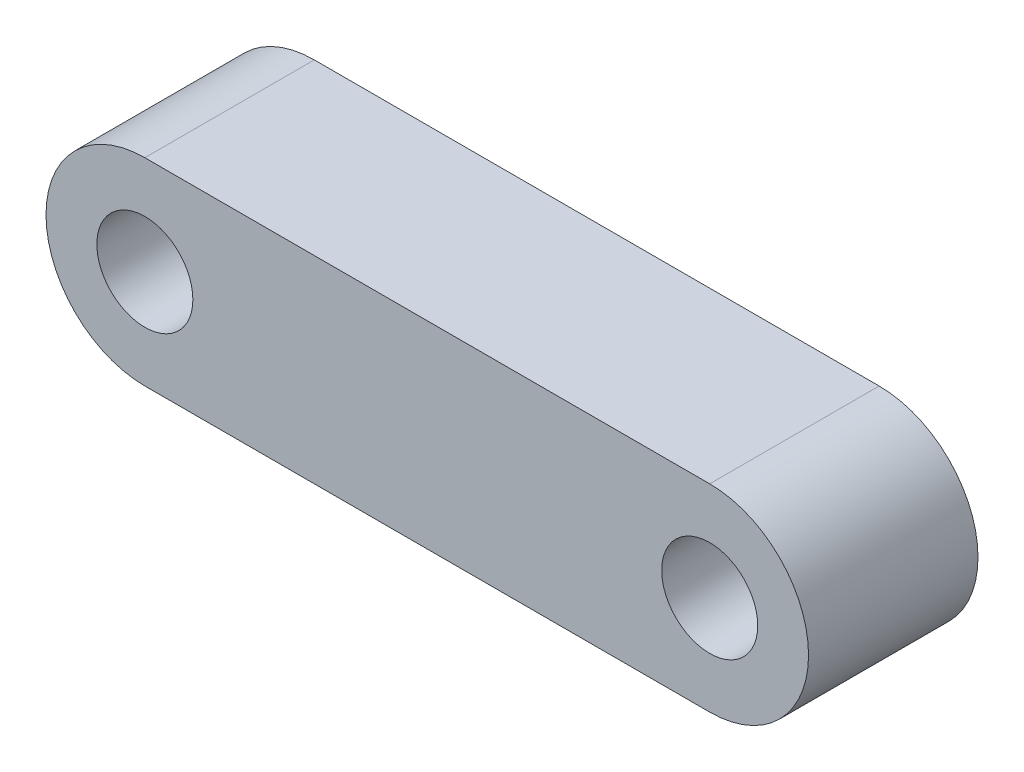
ISO-10303-21;
HEADER;
FILE_DESCRIPTION(('STEP AP214'),'2;1');
FILE_NAME('part.step','',(''),(''),'','','');
FILE_SCHEMA(('AUTOMOTIVE_DESIGN { 1 0 10303 214 1 1 1 1 }'));
ENDSEC;
DATA;
#1=APPLICATION_CONTEXT('core data for automotive mechanical design processes');
#2=APPLICATION_PROTOCOL_DEFINITION('international standard','automotive_design',2000,#1);
#3=PRODUCT_CONTEXT('',#1,'mechanical');
#4=PRODUCT('Part','Part','',(#3));
#5=PRODUCT_RELATED_PRODUCT_CATEGORY('part','',(#4));
#6=PRODUCT_DEFINITION_FORMATION('','',#4);
#7=PRODUCT_DEFINITION_CONTEXT('part definition',#1,'design');
#8=PRODUCT_DEFINITION('design','',#6,#7);
#9=PRODUCT_DEFINITION_SHAPE('','',#8);
#10=(LENGTH_UNIT() NAMED_UNIT(*) SI_UNIT(.MILLI.,.METRE.));
#11=(NAMED_UNIT(*) PLANE_ANGLE_UNIT() SI_UNIT($,.RADIAN.));
#12=(NAMED_UNIT(*) SI_UNIT($,.STERADIAN.) SOLID_ANGLE_UNIT());
#13=UNCERTAINTY_MEASURE_WITH_UNIT(LENGTH_MEASURE(1.E-05),#10,'distance_accuracy_value','');
#14=(GEOMETRIC_REPRESENTATION_CONTEXT(3) GLOBAL_UNCERTAINTY_ASSIGNED_CONTEXT((#13)) GLOBAL_UNIT_ASSIGNED_CONTEXT((#10,
#11,#12)) REPRESENTATION_CONTEXT('',''));
#15=CARTESIAN_POINT('',(0.,0.,0.));
#16=DIRECTION('',(0.,0.,1.));
#17=DIRECTION('',(1.,0.,0.));
#18=AXIS2_PLACEMENT_3D('',#15,#16,#17);
#19=CARTESIAN_POINT('',(0.,0.,0.));
#20=DIRECTION('',(0.,0.,1.));
#21=DIRECTION('',(1.,0.,0.));
#22=AXIS2_PLACEMENT_3D('',#19,#20,#21);
#23=PLANE('',#22);
#24=DIRECTION('',(0.,1.,0.));
#25=VECTOR('',#24,1.);
#26=CARTESIAN_POINT('',(-7.5,-0.5,0.));
#27=LINE('',#26,#25);
#28=CARTESIAN_POINT('',(-7.5,-1.5,0.));
#29=VERTEX_POINT('',#28);
#30=CARTESIAN_POINT('',(-7.5,-0.5,0.));
#31=VERTEX_POINT('',#30);
#32=EDGE_CURVE('E202',#29,#31,#27,.T.);
#33=ORIENTED_EDGE('',*,*,#32,.F.);
#34=DIRECTION('',(1.,0.,0.));
#35=VECTOR('',#34,1.);
#36=CARTESIAN_POINT('',(-7.5,-1.5,0.));
#37=LINE('',#36,#35);
#38=CARTESIAN_POINT('',(7.5,-1.5,0.));
#39=VERTEX_POINT('',#38);
#40=EDGE_CURVE('E226',#29,#39,#37,.T.);
#41=ORIENTED_EDGE('',*,*,#40,.T.);
#42=DIRECTION('',(0.,1.,0.));
#43=VECTOR('',#42,1.);
#44=CARTESIAN_POINT('',(7.5,-0.5,0.));
#45=LINE('',#44,#43);
#46=CARTESIAN_POINT('',(7.5,-0.5,0.));
#47=VERTEX_POINT('',#46);
#48=EDGE_CURVE('E216',#39,#47,#45,.T.);
#49=ORIENTED_EDGE('',*,*,#48,.T.);
#50=DIRECTION('',(1.,0.,0.));
#51=VECTOR('',#50,1.);
#52=CARTESIAN_POINT('',(-7.5,-0.5,0.));
#53=LINE('',#52,#51);
#54=EDGE_CURVE('E215',#31,#47,#53,.T.);
#55=ORIENTED_EDGE('',*,*,#54,.F.);
#56=EDGE_LOOP('',(#33,#41,#49,#55));
#57=FACE_BOUND('',#56,.T.);
#58=CARTESIAN_POINT('',(10.,0.,0.));
#59=DIRECTION('',(0.,0.,1.));
#60=DIRECTION('',(1.,0.,0.));
#61=AXIS2_PLACEMENT_3D('',#58,#59,#60);
#62=CIRCLE('',#61,1.7);
#63=CARTESIAN_POINT('',(11.7,0.,0.));
#64=VERTEX_POINT('',#63);
#65=EDGE_CURVE('E294',#64,#64,#62,.T.);
#66=ORIENTED_EDGE('',*,*,#65,.T.);
#67=EDGE_LOOP('',(#66));
#68=FACE_BOUND('',#67,.T.);
#69=CARTESIAN_POINT('',(-10.,0.,0.));
#70=DIRECTION('',(0.,0.,1.));
#71=DIRECTION('',(1.,0.,0.));
#72=AXIS2_PLACEMENT_3D('',#69,#70,#71);
#73=CIRCLE('',#72,1.7);
#74=CARTESIAN_POINT('',(-8.3,0.,0.));
#75=VERTEX_POINT('',#74);
#76=EDGE_CURVE('E320',#75,#75,#73,.T.);
#77=ORIENTED_EDGE('',*,*,#76,.T.);
#78=EDGE_LOOP('',(#77));
#79=FACE_BOUND('',#78,.T.);
#80=DIRECTION('',(0.,1.,0.));
#81=VECTOR('',#80,1.);
#82=CARTESIAN_POINT('',(-7.5,-2.5,0.));
#83=LINE('',#82,#81);
#84=CARTESIAN_POINT('',(-7.5,-3.5,0.));
#85=VERTEX_POINT('',#84);
#86=CARTESIAN_POINT('',(-7.5,-2.5,0.));
#87=VERTEX_POINT('',#86);
#88=EDGE_CURVE('E234',#85,#87,#83,.T.);
#89=ORIENTED_EDGE('',*,*,#88,.F.);
#90=DIRECTION('',(1.,0.,0.));
#91=VECTOR('',#90,1.);
#92=CARTESIAN_POINT('',(0.,-3.5,0.));
#93=LINE('',#92,#91);
#94=CARTESIAN_POINT('',(-10.,-3.5,0.));
#95=VERTEX_POINT('',#94);
#96=EDGE_CURVE('E324',#95,#85,#93,.T.);
#97=ORIENTED_EDGE('',*,*,#96,.F.);
#98=CARTESIAN_POINT('',(-10.,0.,0.));
#99=DIRECTION('',(0.,0.,1.));
#100=DIRECTION('',(1.,0.,0.));
#101=AXIS2_PLACEMENT_3D('',#98,#99,#100);
#102=CIRCLE('',#101,3.5);
#103=CARTESIAN_POINT('',(-10.,3.5,0.));
#104=VERTEX_POINT('',#103);
#105=EDGE_CURVE('E305',#104,#95,#102,.T.);
#106=ORIENTED_EDGE('',*,*,#105,.F.);
#107=DIRECTION('',(-1.,0.,0.));
#108=VECTOR('',#107,1.);
#109=CARTESIAN_POINT('',(0.,3.5,0.));
#110=LINE('',#109,#108);
#111=CARTESIAN_POINT('',(-7.5,3.5,0.));
#112=VERTEX_POINT('',#111);
#113=EDGE_CURVE('E329',#112,#104,#110,.T.);
#114=ORIENTED_EDGE('',*,*,#113,.F.);
#115=DIRECTION('',(0.,1.,0.));
#116=VECTOR('',#115,1.);
#117=CARTESIAN_POINT('',(-7.5,3.5,0.));
#118=LINE('',#117,#116);
#119=CARTESIAN_POINT('',(-7.5,2.5,0.));
#120=VERTEX_POINT('',#119);
#121=EDGE_CURVE('E265',#120,#112,#118,.T.);
#122=ORIENTED_EDGE('',*,*,#121,.F.);
#123=DIRECTION('',(1.,0.,0.));
#124=VECTOR('',#123,1.);
#125=CARTESIAN_POINT('',(-7.5,2.5,0.));
#126=LINE('',#125,#124);
#127=CARTESIAN_POINT('',(7.5,2.5,0.));
#128=VERTEX_POINT('',#127);
#129=EDGE_CURVE('E291',#120,#128,#126,.T.);
#130=ORIENTED_EDGE('',*,*,#129,.T.);
#131=DIRECTION('',(0.,1.,0.));
#132=VECTOR('',#131,1.);
#133=CARTESIAN_POINT('',(7.5,3.5,0.));
#134=LINE('',#133,#132);
#135=CARTESIAN_POINT('',(7.5,3.5,0.));
#136=VERTEX_POINT('',#135);
#137=EDGE_CURVE('E279',#128,#136,#134,.T.);
#138=ORIENTED_EDGE('',*,*,#137,.T.);
#139=CARTESIAN_POINT('',(10.,3.5,0.));
#140=VERTEX_POINT('',#139);
#141=EDGE_CURVE('E330',#140,#136,#110,.T.);
#142=ORIENTED_EDGE('',*,*,#141,.F.);
#143=CARTESIAN_POINT('',(10.,0.,0.));
#144=DIRECTION('',(0.,0.,1.));
#145=DIRECTION('',(1.,0.,0.));
#146=AXIS2_PLACEMENT_3D('',#143,#144,#145);
#147=CIRCLE('',#146,3.5);
#148=CARTESIAN_POINT('',(10.,-3.5,0.));
#149=VERTEX_POINT('',#148);
#150=EDGE_CURVE('E327',#149,#140,#147,.T.);
#151=ORIENTED_EDGE('',*,*,#150,.F.);
#152=CARTESIAN_POINT('',(7.5,-3.5,0.));
#153=VERTEX_POINT('',#152);
#154=EDGE_CURVE('E323',#153,#149,#93,.T.);
#155=ORIENTED_EDGE('',*,*,#154,.F.);
#156=DIRECTION('',(0.,1.,0.));
#157=VECTOR('',#156,1.);
#158=CARTESIAN_POINT('',(7.5,-2.5,0.));
#159=LINE('',#158,#157);
#160=CARTESIAN_POINT('',(7.5,-2.5,0.));
#161=VERTEX_POINT('',#160);
#162=EDGE_CURVE('E248',#153,#161,#159,.T.);
#163=ORIENTED_EDGE('',*,*,#162,.T.);
#164=DIRECTION('',(1.,0.,0.));
#165=VECTOR('',#164,1.);
#166=CARTESIAN_POINT('',(-7.5,-2.5,0.));
#167=LINE('',#166,#165);
#168=EDGE_CURVE('E247',#87,#161,#167,.T.);
#169=ORIENTED_EDGE('',*,*,#168,.F.);
#170=EDGE_LOOP('',(#89,#97,#106,#114,#122,#130,#138,#142,#151,#155,#163,#169));
#171=FACE_BOUND('',#170,.T.);
#172=DIRECTION('',(0.,1.,0.));
#173=VECTOR('',#172,1.);
#174=CARTESIAN_POINT('',(-7.5,1.5,0.));
#175=LINE('',#174,#173);
#176=CARTESIAN_POINT('',(-7.5,0.5,0.));
#177=VERTEX_POINT('',#176);
#178=CARTESIAN_POINT('',(-7.5,1.5,0.));
#179=VERTEX_POINT('',#178);
#180=EDGE_CURVE('E184',#177,#179,#175,.T.);
#181=ORIENTED_EDGE('',*,*,#180,.F.);
#182=DIRECTION('',(1.,0.,0.));
#183=VECTOR('',#182,1.);
#184=CARTESIAN_POINT('',(-7.5,0.5,0.));
#185=LINE('',#184,#183);
#186=CARTESIAN_POINT('',(7.5,0.5,0.));
#187=VERTEX_POINT('',#186);
#188=EDGE_CURVE('E283',#177,#187,#185,.T.);
#189=ORIENTED_EDGE('',*,*,#188,.T.);
#190=DIRECTION('',(0.,1.,0.));
#191=VECTOR('',#190,1.);
#192=CARTESIAN_POINT('',(7.5,1.5,0.));
#193=LINE('',#192,#191);
#194=CARTESIAN_POINT('',(7.5,1.5,0.));
#195=VERTEX_POINT('',#194);
#196=EDGE_CURVE('E195',#187,#195,#193,.T.);
#197=ORIENTED_EDGE('',*,*,#196,.T.);
#198=DIRECTION('',(1.,0.,0.));
#199=VECTOR('',#198,1.);
#200=CARTESIAN_POINT('',(-7.5,1.5,0.));
#201=LINE('',#200,#199);
#202=EDGE_CURVE('E177',#179,#195,#201,.T.);
#203=ORIENTED_EDGE('',*,*,#202,.F.);
#204=EDGE_LOOP('',(#181,#189,#197,#203));
#205=FACE_BOUND('',#204,.T.);
#206=ADVANCED_FACE('F35',(#57,#68,#79,#171,#205),#23,.F.);
#207=CARTESIAN_POINT('',(0.,-3.5,6.));
#208=DIRECTION('',(0.,1.,0.));
#209=DIRECTION('',(0.,0.,1.));
#210=AXIS2_PLACEMENT_3D('',#207,#208,#209);
#211=PLANE('',#210);
#212=ORIENTED_EDGE('',*,*,#96,.T.);
#213=DIRECTION('',(1.,0.,0.));
#214=VECTOR('',#213,1.);
#215=CARTESIAN_POINT('',(-7.5,-3.5,0.));
#216=LINE('',#215,#214);
#217=EDGE_CURVE('E219',#85,#153,#216,.T.);
#218=ORIENTED_EDGE('',*,*,#217,.T.);
#219=ORIENTED_EDGE('',*,*,#154,.T.);
#220=DIRECTION('',(0.,0.,-1.));
#221=VECTOR('',#220,1.);
#222=CARTESIAN_POINT('',(10.,-3.5,6.));
#223=LINE('',#222,#221);
#224=CARTESIAN_POINT('',(10.,-3.5,6.));
#225=VERTEX_POINT('',#224);
#226=EDGE_CURVE('E11',#225,#149,#223,.T.);
#227=ORIENTED_EDGE('',*,*,#226,.F.);
#228=DIRECTION('',(1.,0.,0.));
#229=VECTOR('',#228,1.);
#230=CARTESIAN_POINT('',(0.,-3.5,6.));
#231=LINE('',#230,#229);
#232=CARTESIAN_POINT('',(-10.,-3.5,6.));
#233=VERTEX_POINT('',#232);
#234=EDGE_CURVE('E308',#233,#225,#231,.T.);
#235=ORIENTED_EDGE('',*,*,#234,.F.);
#236=DIRECTION('',(0.,0.,-1.));
#237=VECTOR('',#236,1.);
#238=CARTESIAN_POINT('',(-10.,-3.5,6.));
#239=LINE('',#238,#237);
#240=EDGE_CURVE('E317',#233,#95,#239,.T.);
#241=ORIENTED_EDGE('',*,*,#240,.T.);
#242=EDGE_LOOP('',(#212,#218,#219,#227,#235,#241));
#243=FACE_BOUND('',#242,.T.);
#244=ADVANCED_FACE('F373',(#243),#211,.F.);
#245=CARTESIAN_POINT('',(10.,0.,6.));
#246=DIRECTION('',(0.,0.,-1.));
#247=DIRECTION('',(-1.,0.,0.));
#248=AXIS2_PLACEMENT_3D('',#245,#246,#247);
#249=CYLINDRICAL_SURFACE('',#248,3.5);
#250=ORIENTED_EDGE('',*,*,#150,.T.);
#251=DIRECTION('',(0.,0.,-1.));
#252=VECTOR('',#251,1.);
#253=CARTESIAN_POINT('',(10.,3.5,6.));
#254=LINE('',#253,#252);
#255=CARTESIAN_POINT('',(10.,3.5,6.));
#256=VERTEX_POINT('',#255);
#257=EDGE_CURVE('E43',#256,#140,#254,.T.);
#258=ORIENTED_EDGE('',*,*,#257,.F.);
#259=CARTESIAN_POINT('',(10.,0.,6.));
#260=DIRECTION('',(0.,0.,1.));
#261=DIRECTION('',(1.,0.,0.));
#262=AXIS2_PLACEMENT_3D('',#259,#260,#261);
#263=CIRCLE('',#262,3.5);
#264=EDGE_CURVE('E311',#225,#256,#263,.T.);
#265=ORIENTED_EDGE('',*,*,#264,.F.);
#266=ORIENTED_EDGE('',*,*,#226,.T.);
#267=EDGE_LOOP('',(#250,#258,#265,#266));
#268=FACE_BOUND('',#267,.T.);
#269=ADVANCED_FACE('F378',(#268),#249,.T.);
#270=CARTESIAN_POINT('',(0.,3.5,6.));
#271=DIRECTION('',(0.,-1.,0.));
#272=DIRECTION('',(1.,0.,0.));
#273=AXIS2_PLACEMENT_3D('',#270,#271,#272);
#274=PLANE('',#273);
#275=ORIENTED_EDGE('',*,*,#141,.T.);
#276=DIRECTION('',(1.,0.,0.));
#277=VECTOR('',#276,1.);
#278=CARTESIAN_POINT('',(-7.5,3.5,0.));
#279=LINE('',#278,#277);
#280=EDGE_CURVE('E278',#112,#136,#279,.T.);
#281=ORIENTED_EDGE('',*,*,#280,.F.);
#282=ORIENTED_EDGE('',*,*,#113,.T.);
#283=DIRECTION('',(0.,0.,-1.));
#284=VECTOR('',#283,1.);
#285=CARTESIAN_POINT('',(-10.,3.5,6.));
#286=LINE('',#285,#284);
#287=CARTESIAN_POINT('',(-10.,3.5,6.));
#288=VERTEX_POINT('',#287);
#289=EDGE_CURVE('E336',#288,#104,#286,.T.);
#290=ORIENTED_EDGE('',*,*,#289,.F.);
#291=DIRECTION('',(-1.,0.,0.));
#292=VECTOR('',#291,1.);
#293=CARTESIAN_POINT('',(0.,3.5,6.));
#294=LINE('',#293,#292);
#295=EDGE_CURVE('E313',#256,#288,#294,.T.);
#296=ORIENTED_EDGE('',*,*,#295,.F.);
#297=ORIENTED_EDGE('',*,*,#257,.T.);
#298=EDGE_LOOP('',(#275,#281,#282,#290,#296,#297));
#299=FACE_BOUND('',#298,.T.);
#300=ADVANCED_FACE('F343',(#299),#274,.F.);
#301=CARTESIAN_POINT('',(-10.,0.,6.));
#302=DIRECTION('',(0.,0.,-1.));
#303=DIRECTION('',(-1.,0.,0.));
#304=AXIS2_PLACEMENT_3D('',#301,#302,#303);
#305=CYLINDRICAL_SURFACE('',#304,1.7);
#306=CARTESIAN_POINT('',(-10.,0.,6.));
#307=DIRECTION('',(0.,0.,1.));
#308=DIRECTION('',(1.,0.,0.));
#309=AXIS2_PLACEMENT_3D('',#306,#307,#308);
#310=CIRCLE('',#309,1.7);
#311=CARTESIAN_POINT('',(-8.3,0.,6.));
#312=VERTEX_POINT('',#311);
#313=EDGE_CURVE('E304',#312,#312,#310,.T.);
#314=ORIENTED_EDGE('',*,*,#313,.T.);
#315=EDGE_LOOP('',(#314));
#316=FACE_BOUND('',#315,.T.);
#317=ORIENTED_EDGE('',*,*,#76,.F.);
#318=EDGE_LOOP('',(#317));
#319=FACE_BOUND('',#318,.T.);
#320=ADVANCED_FACE('F386',(#316,#319),#305,.F.);
#321=CARTESIAN_POINT('',(10.,0.,6.));
#322=DIRECTION('',(0.,0.,-1.));
#323=DIRECTION('',(-1.,0.,0.));
#324=AXIS2_PLACEMENT_3D('',#321,#322,#323);
#325=CYLINDRICAL_SURFACE('',#324,1.7);
#326=CARTESIAN_POINT('',(10.,0.,6.));
#327=DIRECTION('',(0.,0.,1.));
#328=DIRECTION('',(1.,0.,0.));
#329=AXIS2_PLACEMENT_3D('',#326,#327,#328);
#330=CIRCLE('',#329,1.7);
#331=CARTESIAN_POINT('',(11.7,0.,6.));
#332=VERTEX_POINT('',#331);
#333=EDGE_CURVE('E301',#332,#332,#330,.T.);
#334=ORIENTED_EDGE('',*,*,#333,.T.);
#335=EDGE_LOOP('',(#334));
#336=FACE_BOUND('',#335,.T.);
#337=ORIENTED_EDGE('',*,*,#65,.F.);
#338=EDGE_LOOP('',(#337));
#339=FACE_BOUND('',#338,.T.);
#340=ADVANCED_FACE('F37',(#336,#339),#325,.F.);
#341=CARTESIAN_POINT('',(-10.,0.,6.));
#342=DIRECTION('',(0.,0.,-1.));
#343=DIRECTION('',(-1.,0.,0.));
#344=AXIS2_PLACEMENT_3D('',#341,#342,#343);
#345=CYLINDRICAL_SURFACE('',#344,3.5);
#346=ORIENTED_EDGE('',*,*,#105,.T.);
#347=ORIENTED_EDGE('',*,*,#240,.F.);
#348=CARTESIAN_POINT('',(-10.,0.,6.));
#349=DIRECTION('',(0.,0.,1.));
#350=DIRECTION('',(1.,0.,0.));
#351=AXIS2_PLACEMENT_3D('',#348,#349,#350);
#352=CIRCLE('',#351,3.5);
#353=EDGE_CURVE('E315',#288,#233,#352,.T.);
#354=ORIENTED_EDGE('',*,*,#353,.F.);
#355=ORIENTED_EDGE('',*,*,#289,.T.);
#356=EDGE_LOOP('',(#346,#347,#354,#355));
#357=FACE_BOUND('',#356,.T.);
#358=ADVANCED_FACE('F368',(#357),#345,.T.);
#359=CARTESIAN_POINT('',(0.,0.,6.));
#360=DIRECTION('',(0.,0.,1.));
#361=DIRECTION('',(1.,0.,0.));
#362=AXIS2_PLACEMENT_3D('',#359,#360,#361);
#363=PLANE('',#362);
#364=ORIENTED_EDGE('',*,*,#333,.F.);
#365=EDGE_LOOP('',(#364));
#366=FACE_BOUND('',#365,.T.);
#367=ORIENTED_EDGE('',*,*,#313,.F.);
#368=EDGE_LOOP('',(#367));
#369=FACE_BOUND('',#368,.T.);
#370=ORIENTED_EDGE('',*,*,#234,.T.);
#371=ORIENTED_EDGE('',*,*,#264,.T.);
#372=ORIENTED_EDGE('',*,*,#295,.T.);
#373=ORIENTED_EDGE('',*,*,#353,.T.);
#374=EDGE_LOOP('',(#370,#371,#372,#373));
#375=FACE_BOUND('',#374,.T.);
#376=ADVANCED_FACE('F377',(#366,#369,#375),#363,.T.);
#377=CARTESIAN_POINT('',(-7.5,2.9,0.7));
#378=DIRECTION('',(0.,-0.868243142124459,0.496138938356834));
#379=DIRECTION('',(0.,-0.496138938356834,-0.868243142124459));
#380=AXIS2_PLACEMENT_3D('',#377,#378,#379);
#381=PLANE('',#380);
#382=DIRECTION('',(0.,-0.496138938356834,-0.868243142124459));
#383=VECTOR('',#382,1.);
#384=CARTESIAN_POINT('',(7.5,2.9,0.7));
#385=LINE('',#384,#383);
#386=CARTESIAN_POINT('',(7.5,2.9,0.7));
#387=VERTEX_POINT('',#386);
#388=EDGE_CURVE('E269',#387,#128,#385,.T.);
#389=ORIENTED_EDGE('',*,*,#388,.T.);
#390=ORIENTED_EDGE('',*,*,#129,.F.);
#391=DIRECTION('',(0.,-0.496138938356834,-0.868243142124459));
#392=VECTOR('',#391,1.);
#393=CARTESIAN_POINT('',(-7.5,2.9,0.7));
#394=LINE('',#393,#392);
#395=CARTESIAN_POINT('',(-7.5,2.9,0.7));
#396=VERTEX_POINT('',#395);
#397=EDGE_CURVE('E275',#396,#120,#394,.T.);
#398=ORIENTED_EDGE('',*,*,#397,.F.);
#399=DIRECTION('',(1.,0.,0.));
#400=VECTOR('',#399,1.);
#401=CARTESIAN_POINT('',(-7.5,2.9,0.7));
#402=LINE('',#401,#400);
#403=EDGE_CURVE('E295',#396,#387,#402,.T.);
#404=ORIENTED_EDGE('',*,*,#403,.T.);
#405=EDGE_LOOP('',(#389,#390,#398,#404));
#406=FACE_BOUND('',#405,.T.);
#407=ADVANCED_FACE('F357',(#406),#381,.F.);
#408=CARTESIAN_POINT('',(-7.5,3.1,0.7));
#409=DIRECTION('',(0.,0.,1.));
#410=DIRECTION('',(1.,0.,0.));
#411=AXIS2_PLACEMENT_3D('',#408,#409,#410);
#412=PLANE('',#411);
#413=DIRECTION('',(0.,-1.,0.));
#414=VECTOR('',#413,1.);
#415=CARTESIAN_POINT('',(7.5,3.1,0.7));
#416=LINE('',#415,#414);
#417=CARTESIAN_POINT('',(7.5,3.1,0.7));
#418=VERTEX_POINT('',#417);
#419=EDGE_CURVE('E286',#418,#387,#416,.T.);
#420=ORIENTED_EDGE('',*,*,#419,.T.);
#421=ORIENTED_EDGE('',*,*,#403,.F.);
#422=DIRECTION('',(0.,-1.,0.));
#423=VECTOR('',#422,1.);
#424=CARTESIAN_POINT('',(-7.5,3.1,0.7));
#425=LINE('',#424,#423);
#426=CARTESIAN_POINT('',(-7.5,3.1,0.7));
#427=VERTEX_POINT('',#426);
#428=EDGE_CURVE('E272',#427,#396,#425,.T.);
#429=ORIENTED_EDGE('',*,*,#428,.F.);
#430=DIRECTION('',(1.,0.,0.));
#431=VECTOR('',#430,1.);
#432=CARTESIAN_POINT('',(-7.5,3.1,0.7));
#433=LINE('',#432,#431);
#434=EDGE_CURVE('E297',#427,#418,#433,.T.);
#435=ORIENTED_EDGE('',*,*,#434,.T.);
#436=EDGE_LOOP('',(#420,#421,#429,#435));
#437=FACE_BOUND('',#436,.T.);
#438=ADVANCED_FACE('F361',(#437),#412,.F.);
#439=CARTESIAN_POINT('',(-7.5,3.5,0.));
#440=DIRECTION('',(0.,0.868243142124459,0.496138938356834));
#441=DIRECTION('',(0.,-0.496138938356834,0.868243142124459));
#442=AXIS2_PLACEMENT_3D('',#439,#440,#441);
#443=PLANE('',#442);
#444=DIRECTION('',(0.,-0.496138938356834,0.868243142124459));
#445=VECTOR('',#444,1.);
#446=CARTESIAN_POINT('',(7.5,3.5,0.));
#447=LINE('',#446,#445);
#448=EDGE_CURVE('E282',#136,#418,#447,.T.);
#449=ORIENTED_EDGE('',*,*,#448,.T.);
#450=ORIENTED_EDGE('',*,*,#434,.F.);
#451=DIRECTION('',(0.,-0.496138938356834,0.868243142124459));
#452=VECTOR('',#451,1.);
#453=CARTESIAN_POINT('',(-7.5,3.5,0.));
#454=LINE('',#453,#452);
#455=EDGE_CURVE('E268',#112,#427,#454,.T.);
#456=ORIENTED_EDGE('',*,*,#455,.F.);
#457=ORIENTED_EDGE('',*,*,#280,.T.);
#458=EDGE_LOOP('',(#449,#450,#456,#457));
#459=FACE_BOUND('',#458,.T.);
#460=ADVANCED_FACE('F363',(#459),#443,.F.);
#461=CARTESIAN_POINT('',(-7.5,0.,0.));
#462=DIRECTION('',(1.,0.,0.));
#463=DIRECTION('',(0.,0.,-1.));
#464=AXIS2_PLACEMENT_3D('',#461,#462,#463);
#465=PLANE('',#464);
#466=ORIENTED_EDGE('',*,*,#121,.T.);
#467=ORIENTED_EDGE('',*,*,#455,.T.);
#468=ORIENTED_EDGE('',*,*,#428,.T.);
#469=ORIENTED_EDGE('',*,*,#397,.T.);
#470=EDGE_LOOP('',(#466,#467,#468,#469));
#471=FACE_BOUND('',#470,.T.);
#472=ADVANCED_FACE('F453',(#471),#465,.T.);
#473=CARTESIAN_POINT('',(7.5,0.,0.));
#474=DIRECTION('',(1.,0.,0.));
#475=DIRECTION('',(0.,0.,-1.));
#476=AXIS2_PLACEMENT_3D('',#473,#474,#475);
#477=PLANE('',#476);
#478=ORIENTED_EDGE('',*,*,#137,.F.);
#479=ORIENTED_EDGE('',*,*,#388,.F.);
#480=ORIENTED_EDGE('',*,*,#419,.F.);
#481=ORIENTED_EDGE('',*,*,#448,.F.);
#482=EDGE_LOOP('',(#478,#479,#480,#481));
#483=FACE_BOUND('',#482,.T.);
#484=ADVANCED_FACE('F354',(#483),#477,.F.);
#485=CARTESIAN_POINT('',(-7.5,-3.1,0.699999999999937));
#486=DIRECTION('',(0.,-0.868243142124459,0.496138938356834));
#487=DIRECTION('',(0.,-0.496138938356834,-0.868243142124459));
#488=AXIS2_PLACEMENT_3D('',#485,#486,#487);
#489=PLANE('',#488);
#490=DIRECTION('',(0.,-0.496138938356834,-0.868243142124459));
#491=VECTOR('',#490,1.);
#492=CARTESIAN_POINT('',(7.5,-3.1,0.699999999999937));
#493=LINE('',#492,#491);
#494=CARTESIAN_POINT('',(7.5,-3.1,0.699999999999937));
#495=VERTEX_POINT('',#494);
#496=EDGE_CURVE('E238',#495,#153,#493,.T.);
#497=ORIENTED_EDGE('',*,*,#496,.T.);
#498=ORIENTED_EDGE('',*,*,#217,.F.);
#499=DIRECTION('',(0.,-0.496138938356834,-0.868243142124459));
#500=VECTOR('',#499,1.);
#501=CARTESIAN_POINT('',(-7.5,-3.1,0.699999999999937));
#502=LINE('',#501,#500);
#503=CARTESIAN_POINT('',(-7.5,-3.1,0.699999999999937));
#504=VERTEX_POINT('',#503);
#505=EDGE_CURVE('E244',#504,#85,#502,.T.);
#506=ORIENTED_EDGE('',*,*,#505,.F.);
#507=DIRECTION('',(1.,0.,0.));
#508=VECTOR('',#507,1.);
#509=CARTESIAN_POINT('',(-7.5,-3.1,0.699999999999937));
#510=LINE('',#509,#508);
#511=EDGE_CURVE('E260',#504,#495,#510,.T.);
#512=ORIENTED_EDGE('',*,*,#511,.T.);
#513=EDGE_LOOP('',(#497,#498,#506,#512));
#514=FACE_BOUND('',#513,.T.);
#515=ADVANCED_FACE('F470',(#514),#489,.F.);
#516=CARTESIAN_POINT('',(-7.5,-2.9,0.699999999999937));
#517=DIRECTION('',(0.,0.,1.));
#518=DIRECTION('',(1.,0.,0.));
#519=AXIS2_PLACEMENT_3D('',#516,#517,#518);
#520=PLANE('',#519);
#521=DIRECTION('',(0.,-1.,0.));
#522=VECTOR('',#521,1.);
#523=CARTESIAN_POINT('',(7.5,-2.9,0.699999999999937));
#524=LINE('',#523,#522);
#525=CARTESIAN_POINT('',(7.5,-2.9,0.699999999999937));
#526=VERTEX_POINT('',#525);
#527=EDGE_CURVE('E254',#526,#495,#524,.T.);
#528=ORIENTED_EDGE('',*,*,#527,.T.);
#529=ORIENTED_EDGE('',*,*,#511,.F.);
#530=DIRECTION('',(0.,-1.,0.));
#531=VECTOR('',#530,1.);
#532=CARTESIAN_POINT('',(-7.5,-2.9,0.699999999999937));
#533=LINE('',#532,#531);
#534=CARTESIAN_POINT('',(-7.5,-2.9,0.699999999999937));
#535=VERTEX_POINT('',#534);
#536=EDGE_CURVE('E241',#535,#504,#533,.T.);
#537=ORIENTED_EDGE('',*,*,#536,.F.);
#538=DIRECTION('',(1.,0.,0.));
#539=VECTOR('',#538,1.);
#540=CARTESIAN_POINT('',(-7.5,-2.9,0.699999999999937));
#541=LINE('',#540,#539);
#542=EDGE_CURVE('E262',#535,#526,#541,.T.);
#543=ORIENTED_EDGE('',*,*,#542,.T.);
#544=EDGE_LOOP('',(#528,#529,#537,#543));
#545=FACE_BOUND('',#544,.T.);
#546=ADVANCED_FACE('F479',(#545),#520,.F.);
#547=CARTESIAN_POINT('',(-7.5,-2.5,0.));
#548=DIRECTION('',(0.,0.868243142124459,0.496138938356834));
#549=DIRECTION('',(0.,-0.496138938356834,0.868243142124459));
#550=AXIS2_PLACEMENT_3D('',#547,#548,#549);
#551=PLANE('',#550);
#552=DIRECTION('',(0.,-0.496138938356834,0.868243142124459));
#553=VECTOR('',#552,1.);
#554=CARTESIAN_POINT('',(7.5,-2.5,0.));
#555=LINE('',#554,#553);
#556=EDGE_CURVE('E251',#161,#526,#555,.T.);
#557=ORIENTED_EDGE('',*,*,#556,.T.);
#558=ORIENTED_EDGE('',*,*,#542,.F.);
#559=DIRECTION('',(0.,-0.496138938356834,0.868243142124459));
#560=VECTOR('',#559,1.);
#561=CARTESIAN_POINT('',(-7.5,-2.5,0.));
#562=LINE('',#561,#560);
#563=EDGE_CURVE('E237',#87,#535,#562,.T.);
#564=ORIENTED_EDGE('',*,*,#563,.F.);
#565=ORIENTED_EDGE('',*,*,#168,.T.);
#566=EDGE_LOOP('',(#557,#558,#564,#565));
#567=FACE_BOUND('',#566,.T.);
#568=ADVANCED_FACE('F489',(#567),#551,.F.);
#569=CARTESIAN_POINT('',(-7.5,0.,0.));
#570=DIRECTION('',(1.,0.,0.));
#571=DIRECTION('',(0.,0.,-1.));
#572=AXIS2_PLACEMENT_3D('',#569,#570,#571);
#573=PLANE('',#572);
#574=ORIENTED_EDGE('',*,*,#88,.T.);
#575=ORIENTED_EDGE('',*,*,#563,.T.);
#576=ORIENTED_EDGE('',*,*,#536,.T.);
#577=ORIENTED_EDGE('',*,*,#505,.T.);
#578=EDGE_LOOP('',(#574,#575,#576,#577));
#579=FACE_BOUND('',#578,.T.);
#580=ADVANCED_FACE('F499',(#579),#573,.T.);
#581=CARTESIAN_POINT('',(7.5,0.,0.));
#582=DIRECTION('',(1.,0.,0.));
#583=DIRECTION('',(0.,0.,-1.));
#584=AXIS2_PLACEMENT_3D('',#581,#582,#583);
#585=PLANE('',#584);
#586=ORIENTED_EDGE('',*,*,#162,.F.);
#587=ORIENTED_EDGE('',*,*,#496,.F.);
#588=ORIENTED_EDGE('',*,*,#527,.F.);
#589=ORIENTED_EDGE('',*,*,#556,.F.);
#590=EDGE_LOOP('',(#586,#587,#588,#589));
#591=FACE_BOUND('',#590,.T.);
#592=ADVANCED_FACE('F509',(#591),#585,.F.);
#593=CARTESIAN_POINT('',(-7.5,-1.1,0.699999999999958));
#594=DIRECTION('',(0.,-0.868243142124459,0.496138938356834));
#595=DIRECTION('',(0.,-0.496138938356834,-0.868243142124459));
#596=AXIS2_PLACEMENT_3D('',#593,#594,#595);
#597=PLANE('',#596);
#598=DIRECTION('',(0.,-0.496138938356834,-0.868243142124459));
#599=VECTOR('',#598,1.);
#600=CARTESIAN_POINT('',(7.5,-1.1,0.699999999999958));
#601=LINE('',#600,#599);
#602=CARTESIAN_POINT('',(7.5,-1.1,0.699999999999958));
#603=VERTEX_POINT('',#602);
#604=EDGE_CURVE('E206',#603,#39,#601,.T.);
#605=ORIENTED_EDGE('',*,*,#604,.T.);
#606=ORIENTED_EDGE('',*,*,#40,.F.);
#607=DIRECTION('',(0.,-0.496138938356834,-0.868243142124459));
#608=VECTOR('',#607,1.);
#609=CARTESIAN_POINT('',(-7.5,-1.1,0.699999999999958));
#610=LINE('',#609,#608);
#611=CARTESIAN_POINT('',(-7.5,-1.1,0.699999999999958));
#612=VERTEX_POINT('',#611);
#613=EDGE_CURVE('E212',#612,#29,#610,.T.);
#614=ORIENTED_EDGE('',*,*,#613,.F.);
#615=DIRECTION('',(1.,0.,0.));
#616=VECTOR('',#615,1.);
#617=CARTESIAN_POINT('',(-7.5,-1.1,0.699999999999958));
#618=LINE('',#617,#616);
#619=EDGE_CURVE('E229',#612,#603,#618,.T.);
#620=ORIENTED_EDGE('',*,*,#619,.T.);
#621=EDGE_LOOP('',(#605,#606,#614,#620));
#622=FACE_BOUND('',#621,.T.);
#623=ADVANCED_FACE('F519',(#622),#597,.F.);
#624=CARTESIAN_POINT('',(-7.5,-0.9,0.699999999999958));
#625=DIRECTION('',(0.,0.,1.));
#626=DIRECTION('',(1.,0.,0.));
#627=AXIS2_PLACEMENT_3D('',#624,#625,#626);
#628=PLANE('',#627);
#629=DIRECTION('',(0.,-1.,0.));
#630=VECTOR('',#629,1.);
#631=CARTESIAN_POINT('',(7.5,-0.9,0.699999999999958));
#632=LINE('',#631,#630);
#633=CARTESIAN_POINT('',(7.5,-0.9,0.699999999999958));
#634=VERTEX_POINT('',#633);
#635=EDGE_CURVE('E221',#634,#603,#632,.T.);
#636=ORIENTED_EDGE('',*,*,#635,.T.);
#637=ORIENTED_EDGE('',*,*,#619,.F.);
#638=DIRECTION('',(0.,-1.,0.));
#639=VECTOR('',#638,1.);
#640=CARTESIAN_POINT('',(-7.5,-0.9,0.699999999999958));
#641=LINE('',#640,#639);
#642=CARTESIAN_POINT('',(-7.5,-0.9,0.699999999999958));
#643=VERTEX_POINT('',#642);
#644=EDGE_CURVE('E209',#643,#612,#641,.T.);
#645=ORIENTED_EDGE('',*,*,#644,.F.);
#646=DIRECTION('',(1.,0.,0.));
#647=VECTOR('',#646,1.);
#648=CARTESIAN_POINT('',(-7.5,-0.9,0.699999999999958));
#649=LINE('',#648,#647);
#650=EDGE_CURVE('E231',#643,#634,#649,.T.);
#651=ORIENTED_EDGE('',*,*,#650,.T.);
#652=EDGE_LOOP('',(#636,#637,#645,#651));
#653=FACE_BOUND('',#652,.T.);
#654=ADVANCED_FACE('F529',(#653),#628,.F.);
#655=CARTESIAN_POINT('',(-7.5,-0.5,0.));
#656=DIRECTION('',(0.,0.868243142124459,0.496138938356834));
#657=DIRECTION('',(0.,-0.496138938356834,0.868243142124459));
#658=AXIS2_PLACEMENT_3D('',#655,#656,#657);
#659=PLANE('',#658);
#660=DIRECTION('',(0.,-0.496138938356834,0.868243142124459));
#661=VECTOR('',#660,1.);
#662=CARTESIAN_POINT('',(7.5,-0.5,0.));
#663=LINE('',#662,#661);
#664=EDGE_CURVE('E58',#47,#634,#663,.T.);
#665=ORIENTED_EDGE('',*,*,#664,.T.);
#666=ORIENTED_EDGE('',*,*,#650,.F.);
#667=DIRECTION('',(0.,-0.496138938356834,0.868243142124459));
#668=VECTOR('',#667,1.);
#669=CARTESIAN_POINT('',(-7.5,-0.5,0.));
#670=LINE('',#669,#668);
#671=EDGE_CURVE('E205',#31,#643,#670,.T.);
#672=ORIENTED_EDGE('',*,*,#671,.F.);
#673=ORIENTED_EDGE('',*,*,#54,.T.);
#674=EDGE_LOOP('',(#665,#666,#672,#673));
#675=FACE_BOUND('',#674,.T.);
#676=ADVANCED_FACE('F539',(#675),#659,.F.);
#677=CARTESIAN_POINT('',(-7.5,0.,0.));
#678=DIRECTION('',(1.,0.,0.));
#679=DIRECTION('',(0.,0.,-1.));
#680=AXIS2_PLACEMENT_3D('',#677,#678,#679);
#681=PLANE('',#680);
#682=ORIENTED_EDGE('',*,*,#32,.T.);
#683=ORIENTED_EDGE('',*,*,#671,.T.);
#684=ORIENTED_EDGE('',*,*,#644,.T.);
#685=ORIENTED_EDGE('',*,*,#613,.T.);
#686=EDGE_LOOP('',(#682,#683,#684,#685));
#687=FACE_BOUND('',#686,.T.);
#688=ADVANCED_FACE('F549',(#687),#681,.T.);
#689=CARTESIAN_POINT('',(7.5,0.,0.));
#690=DIRECTION('',(1.,0.,0.));
#691=DIRECTION('',(0.,0.,-1.));
#692=AXIS2_PLACEMENT_3D('',#689,#690,#691);
#693=PLANE('',#692);
#694=ORIENTED_EDGE('',*,*,#48,.F.);
#695=ORIENTED_EDGE('',*,*,#604,.F.);
#696=ORIENTED_EDGE('',*,*,#635,.F.);
#697=ORIENTED_EDGE('',*,*,#664,.F.);
#698=EDGE_LOOP('',(#694,#695,#696,#697));
#699=FACE_BOUND('',#698,.T.);
#700=ADVANCED_FACE('F559',(#699),#693,.F.);
#701=CARTESIAN_POINT('',(-7.5,0.900000000000001,0.699999999999979));
#702=DIRECTION('',(0.,-0.868243142124459,0.496138938356834));
#703=DIRECTION('',(0.,-0.496138938356834,-0.868243142124459));
#704=AXIS2_PLACEMENT_3D('',#701,#702,#703);
#705=PLANE('',#704);
#706=DIRECTION('',(0.,-0.496138938356834,-0.868243142124459));
#707=VECTOR('',#706,1.);
#708=CARTESIAN_POINT('',(7.5,0.900000000000001,0.699999999999979));
#709=LINE('',#708,#707);
#710=CARTESIAN_POINT('',(7.5,0.900000000000001,0.699999999999979));
#711=VERTEX_POINT('',#710);
#712=EDGE_CURVE('E193',#711,#187,#709,.T.);
#713=ORIENTED_EDGE('',*,*,#712,.T.);
#714=ORIENTED_EDGE('',*,*,#188,.F.);
#715=DIRECTION('',(0.,-0.496138938356834,-0.868243142124459));
#716=VECTOR('',#715,1.);
#717=CARTESIAN_POINT('',(-7.5,0.900000000000001,0.699999999999979));
#718=LINE('',#717,#716);
#719=CARTESIAN_POINT('',(-7.5,0.900000000000001,0.699999999999979));
#720=VERTEX_POINT('',#719);
#721=EDGE_CURVE('E190',#720,#177,#718,.T.);
#722=ORIENTED_EDGE('',*,*,#721,.F.);
#723=DIRECTION('',(1.,0.,0.));
#724=VECTOR('',#723,1.);
#725=CARTESIAN_POINT('',(-7.5,0.900000000000001,0.699999999999979));
#726=LINE('',#725,#724);
#727=EDGE_CURVE('E197',#720,#711,#726,.T.);
#728=ORIENTED_EDGE('',*,*,#727,.T.);
#729=EDGE_LOOP('',(#713,#714,#722,#728));
#730=FACE_BOUND('',#729,.T.);
#731=ADVANCED_FACE('F569',(#730),#705,.F.);
#732=CARTESIAN_POINT('',(-7.5,1.1,0.699999999999979));
#733=DIRECTION('',(0.,0.,1.));
#734=DIRECTION('',(1.,0.,0.));
#735=AXIS2_PLACEMENT_3D('',#732,#733,#734);
#736=PLANE('',#735);
#737=DIRECTION('',(0.,-1.,0.));
#738=VECTOR('',#737,1.);
#739=CARTESIAN_POINT('',(7.5,1.1,0.699999999999979));
#740=LINE('',#739,#738);
#741=CARTESIAN_POINT('',(7.5,1.1,0.699999999999979));
#742=VERTEX_POINT('',#741);
#743=EDGE_CURVE('E621',#742,#711,#740,.T.);
#744=ORIENTED_EDGE('',*,*,#743,.T.);
#745=ORIENTED_EDGE('',*,*,#727,.F.);
#746=DIRECTION('',(0.,-1.,0.));
#747=VECTOR('',#746,1.);
#748=CARTESIAN_POINT('',(-7.5,1.1,0.699999999999979));
#749=LINE('',#748,#747);
#750=CARTESIAN_POINT('',(-7.5,1.1,0.699999999999979));
#751=VERTEX_POINT('',#750);
#752=EDGE_CURVE('E183',#751,#720,#749,.T.);
#753=ORIENTED_EDGE('',*,*,#752,.F.);
#754=DIRECTION('',(1.,0.,0.));
#755=VECTOR('',#754,1.);
#756=CARTESIAN_POINT('',(-7.5,1.1,0.699999999999979));
#757=LINE('',#756,#755);
#758=EDGE_CURVE('E179',#751,#742,#757,.T.);
#759=ORIENTED_EDGE('',*,*,#758,.T.);
#760=EDGE_LOOP('',(#744,#745,#753,#759));
#761=FACE_BOUND('',#760,.T.);
#762=ADVANCED_FACE('F578',(#761),#736,.F.);
#763=CARTESIAN_POINT('',(-7.5,1.5,0.));
#764=DIRECTION('',(0.,0.868243142124459,0.496138938356834));
#765=DIRECTION('',(0.,-0.496138938356834,0.868243142124459));
#766=AXIS2_PLACEMENT_3D('',#763,#764,#765);
#767=PLANE('',#766);
#768=DIRECTION('',(0.,-0.496138938356834,0.868243142124459));
#769=VECTOR('',#768,1.);
#770=CARTESIAN_POINT('',(7.5,1.5,0.));
#771=LINE('',#770,#769);
#772=EDGE_CURVE('E50',#195,#742,#771,.T.);
#773=ORIENTED_EDGE('',*,*,#772,.T.);
#774=ORIENTED_EDGE('',*,*,#758,.F.);
#775=DIRECTION('',(0.,-0.496138938356834,0.868243142124459));
#776=VECTOR('',#775,1.);
#777=CARTESIAN_POINT('',(-7.5,1.5,0.));
#778=LINE('',#777,#776);
#779=EDGE_CURVE('E173',#179,#751,#778,.T.);
#780=ORIENTED_EDGE('',*,*,#779,.F.);
#781=ORIENTED_EDGE('',*,*,#202,.T.);
#782=EDGE_LOOP('',(#773,#774,#780,#781));
#783=FACE_BOUND('',#782,.T.);
#784=ADVANCED_FACE('F175',(#783),#767,.F.);
#785=CARTESIAN_POINT('',(-7.5,0.,0.));
#786=DIRECTION('',(1.,0.,0.));
#787=DIRECTION('',(0.,0.,-1.));
#788=AXIS2_PLACEMENT_3D('',#785,#786,#787);
#789=PLANE('',#788);
#790=ORIENTED_EDGE('',*,*,#180,.T.);
#791=ORIENTED_EDGE('',*,*,#779,.T.);
#792=ORIENTED_EDGE('',*,*,#752,.T.);
#793=ORIENTED_EDGE('',*,*,#721,.T.);
#794=EDGE_LOOP('',(#790,#791,#792,#793));
#795=FACE_BOUND('',#794,.T.);
#796=ADVANCED_FACE('F188',(#795),#789,.T.);
#797=CARTESIAN_POINT('',(7.5,0.,0.));
#798=DIRECTION('',(1.,0.,0.));
#799=DIRECTION('',(0.,0.,-1.));
#800=AXIS2_PLACEMENT_3D('',#797,#798,#799);
#801=PLANE('',#800);
#802=ORIENTED_EDGE('',*,*,#196,.F.);
#803=ORIENTED_EDGE('',*,*,#712,.F.);
#804=ORIENTED_EDGE('',*,*,#743,.F.);
#805=ORIENTED_EDGE('',*,*,#772,.F.);
#806=EDGE_LOOP('',(#802,#803,#804,#805));
#807=FACE_BOUND('',#806,.T.);
#808=ADVANCED_FACE('F605',(#807),#801,.F.);
#809=CLOSED_SHELL('',(#206,#244,#269,#300,#320,#340,#358,#376,#407,#438,#460,#472,#484,#515,
#546,#568,#580,#592,#623,#654,#676,#688,#700,#731,#762,#784,#796,#808));
#810=MANIFOLD_SOLID_BREP('B2',#809);
#811=ADVANCED_BREP_SHAPE_REPRESENTATION('',(#18,#810),#14);
#812=SHAPE_DEFINITION_REPRESENTATION(#9,#811);
ENDSEC;
END-ISO-10303-21;
